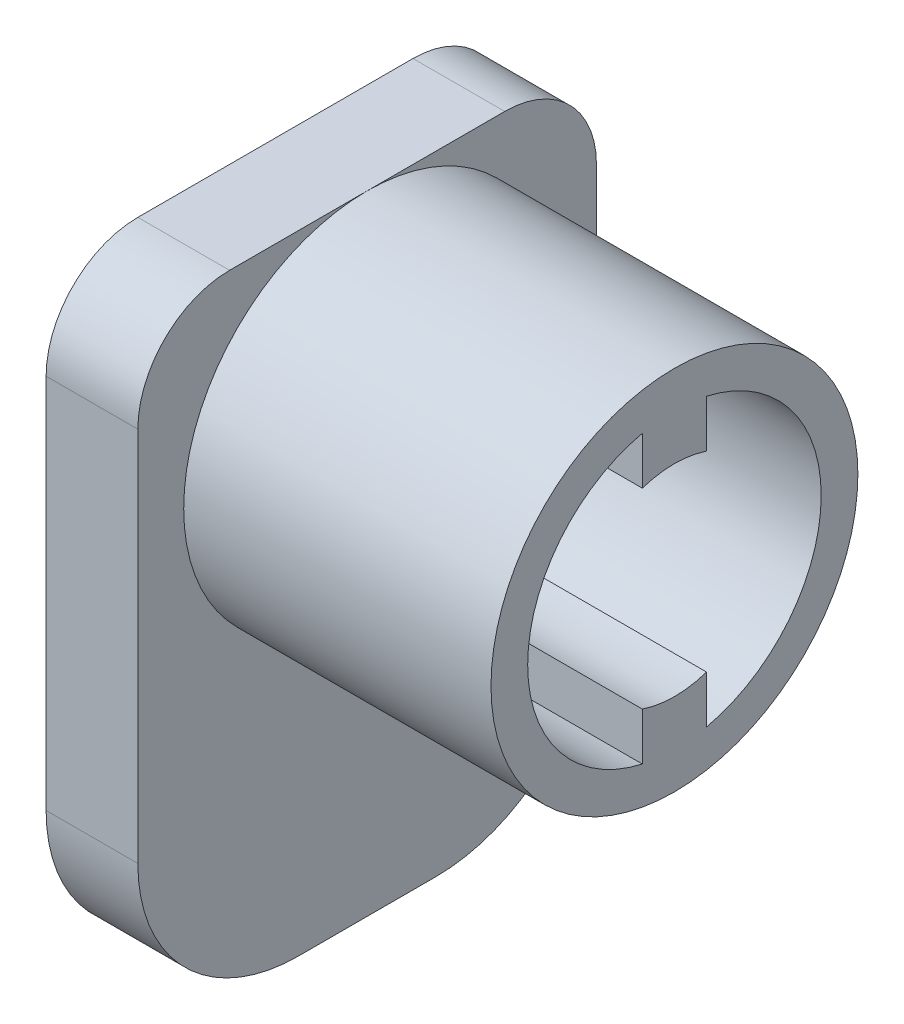
ISO-10303-21;
HEADER;
FILE_DESCRIPTION(('STEP AP214'),'2;1');
FILE_NAME('part.step','',(''),(''),'','','');
FILE_SCHEMA(('AUTOMOTIVE_DESIGN { 1 0 10303 214 1 1 1 1 }'));
ENDSEC;
DATA;
#1=APPLICATION_CONTEXT('core data for automotive mechanical design processes');
#2=APPLICATION_PROTOCOL_DEFINITION('international standard','automotive_design',2000,#1);
#3=PRODUCT_CONTEXT('',#1,'mechanical');
#4=PRODUCT('Part','Part','',(#3));
#5=PRODUCT_RELATED_PRODUCT_CATEGORY('part','',(#4));
#6=PRODUCT_DEFINITION_FORMATION('','',#4);
#7=PRODUCT_DEFINITION_CONTEXT('part definition',#1,'design');
#8=PRODUCT_DEFINITION('design','',#6,#7);
#9=PRODUCT_DEFINITION_SHAPE('','',#8);
#10=(LENGTH_UNIT() NAMED_UNIT(*) SI_UNIT(.MILLI.,.METRE.));
#11=(NAMED_UNIT(*) PLANE_ANGLE_UNIT() SI_UNIT($,.RADIAN.));
#12=(NAMED_UNIT(*) SI_UNIT($,.STERADIAN.) SOLID_ANGLE_UNIT());
#13=UNCERTAINTY_MEASURE_WITH_UNIT(LENGTH_MEASURE(1.E-05),#10,'distance_accuracy_value','');
#14=(GEOMETRIC_REPRESENTATION_CONTEXT(3) GLOBAL_UNCERTAINTY_ASSIGNED_CONTEXT((#13)) GLOBAL_UNIT_ASSIGNED_CONTEXT((#10,
#11,#12)) REPRESENTATION_CONTEXT('',''));
#15=CARTESIAN_POINT('',(0.,0.,0.));
#16=DIRECTION('',(0.,0.,1.));
#17=DIRECTION('',(1.,0.,0.));
#18=AXIS2_PLACEMENT_3D('',#15,#16,#17);
#19=CARTESIAN_POINT('',(-15.7509667991878,0.,0.));
#20=DIRECTION('',(1.,0.,0.));
#21=DIRECTION('',(0.,0.,-1.));
#22=AXIS2_PLACEMENT_3D('',#19,#20,#21);
#23=CYLINDRICAL_SURFACE('',#22,3.2);
#24=CARTESIAN_POINT('',(-6.7,0.,0.));
#25=DIRECTION('',(-1.,0.,0.));
#26=DIRECTION('',(0.,0.,1.));
#27=AXIS2_PLACEMENT_3D('',#24,#25,#26);
#28=CIRCLE('',#27,3.2);
#29=CARTESIAN_POINT('',(-6.7,3.1224989991992,0.7));
#30=VERTEX_POINT('',#29);
#31=CARTESIAN_POINT('',(-6.7,-3.1224989991992,0.7));
#32=VERTEX_POINT('',#31);
#33=EDGE_CURVE('E167',#30,#32,#28,.F.);
#34=ORIENTED_EDGE('',*,*,#33,.F.);
#35=DIRECTION('',(-1.,0.,0.));
#36=VECTOR('',#35,1.);
#37=CARTESIAN_POINT('',(1.78934113199437,3.1224989991992,0.7));
#38=LINE('',#37,#36);
#39=CARTESIAN_POINT('',(0.,3.1224989991992,0.7));
#40=VERTEX_POINT('',#39);
#41=EDGE_CURVE('E154',#40,#30,#38,.T.);
#42=ORIENTED_EDGE('',*,*,#41,.F.);
#43=CARTESIAN_POINT('',(0.,0.,0.));
#44=DIRECTION('',(1.,0.,0.));
#45=DIRECTION('',(0.,0.,-1.));
#46=AXIS2_PLACEMENT_3D('',#43,#44,#45);
#47=CIRCLE('',#46,3.2);
#48=CARTESIAN_POINT('',(0.,-3.1224989991992,0.7));
#49=VERTEX_POINT('',#48);
#50=EDGE_CURVE('E165',#40,#49,#47,.T.);
#51=ORIENTED_EDGE('',*,*,#50,.T.);
#52=DIRECTION('',(-1.,0.,0.));
#53=VECTOR('',#52,1.);
#54=CARTESIAN_POINT('',(1.78934113199437,-3.1224989991992,0.7));
#55=LINE('',#54,#53);
#56=EDGE_CURVE('E340',#49,#32,#55,.T.);
#57=ORIENTED_EDGE('',*,*,#56,.T.);
#58=EDGE_LOOP('',(#34,#42,#51,#57));
#59=FACE_BOUND('',#58,.T.);
#60=ADVANCED_FACE('F33',(#59),#23,.F.);
#61=CARTESIAN_POINT('',(-6.7,0.,0.));
#62=DIRECTION('',(1.,0.,0.));
#63=DIRECTION('',(0.,0.,-1.));
#64=AXIS2_PLACEMENT_3D('',#61,#62,#63);
#65=CYLINDRICAL_SURFACE('',#64,4.);
#66=CARTESIAN_POINT('',(-6.7,0.,0.));
#67=DIRECTION('',(1.,0.,0.));
#68=DIRECTION('',(0.,0.,-1.));
#69=AXIS2_PLACEMENT_3D('',#66,#67,#68);
#70=CIRCLE('',#69,4.);
#71=CARTESIAN_POINT('',(-6.7,4.,0.));
#72=VERTEX_POINT('',#71);
#73=EDGE_CURVE('E209',#72,#72,#70,.T.);
#74=ORIENTED_EDGE('',*,*,#73,.T.);
#75=EDGE_LOOP('',(#74));
#76=FACE_BOUND('',#75,.T.);
#77=CARTESIAN_POINT('',(0.,0.,0.));
#78=DIRECTION('',(1.,0.,0.));
#79=DIRECTION('',(0.,0.,-1.));
#80=AXIS2_PLACEMENT_3D('',#77,#78,#79);
#81=CIRCLE('',#80,4.);
#82=CARTESIAN_POINT('',(0.,0.,-4.));
#83=VERTEX_POINT('',#82);
#84=EDGE_CURVE('E200',#83,#83,#81,.T.);
#85=ORIENTED_EDGE('',*,*,#84,.F.);
#86=EDGE_LOOP('',(#85));
#87=FACE_BOUND('',#86,.T.);
#88=ADVANCED_FACE('F280',(#76,#87),#65,.T.);
#89=CARTESIAN_POINT('',(0.,0.,0.));
#90=DIRECTION('',(1.,0.,0.));
#91=DIRECTION('',(0.,0.,-1.));
#92=AXIS2_PLACEMENT_3D('',#89,#90,#91);
#93=PLANE('',#92);
#94=CARTESIAN_POINT('',(0.,-3.1224989991992,-0.7));
#95=VERTEX_POINT('',#94);
#96=CARTESIAN_POINT('',(0.,3.1224989991992,-0.700000000000001));
#97=VERTEX_POINT('',#96);
#98=EDGE_CURVE('E176',#95,#97,#47,.T.);
#99=ORIENTED_EDGE('',*,*,#98,.F.);
#100=DIRECTION('',(0.,-1.,0.));
#101=VECTOR('',#100,1.);
#102=CARTESIAN_POINT('',(0.,-2.86181760425084,-0.7));
#103=LINE('',#102,#101);
#104=CARTESIAN_POINT('',(0.,-2.08566536146142,-0.699999999999999));
#105=VERTEX_POINT('',#104);
#106=EDGE_CURVE('E314',#105,#95,#103,.T.);
#107=ORIENTED_EDGE('',*,*,#106,.F.);
#108=CARTESIAN_POINT('',(0.,0.,0.));
#109=DIRECTION('',(1.,0.,0.));
#110=DIRECTION('',(0.,0.,-1.));
#111=AXIS2_PLACEMENT_3D('',#108,#109,#110);
#112=CIRCLE('',#111,2.2);
#113=CARTESIAN_POINT('',(0.,-2.08566536146142,0.7));
#114=VERTEX_POINT('',#113);
#115=EDGE_CURVE('E335',#114,#105,#112,.T.);
#116=ORIENTED_EDGE('',*,*,#115,.F.);
#117=DIRECTION('',(0.,1.,0.));
#118=VECTOR('',#117,1.);
#119=CARTESIAN_POINT('',(0.,-2.86181760425084,0.7));
#120=LINE('',#119,#118);
#121=EDGE_CURVE('E174',#49,#114,#120,.T.);
#122=ORIENTED_EDGE('',*,*,#121,.F.);
#123=ORIENTED_EDGE('',*,*,#50,.F.);
#124=DIRECTION('',(0.,1.,0.));
#125=VECTOR('',#124,1.);
#126=CARTESIAN_POINT('',(0.,2.86181760425084,0.7));
#127=LINE('',#126,#125);
#128=CARTESIAN_POINT('',(0.,2.08566536146142,0.699999999999999));
#129=VERTEX_POINT('',#128);
#130=EDGE_CURVE('E151',#129,#40,#127,.T.);
#131=ORIENTED_EDGE('',*,*,#130,.F.);
#132=CARTESIAN_POINT('',(0.,0.,0.));
#133=DIRECTION('',(1.,0.,0.));
#134=DIRECTION('',(0.,0.,-1.));
#135=AXIS2_PLACEMENT_3D('',#132,#133,#134);
#136=CIRCLE('',#135,2.2);
#137=CARTESIAN_POINT('',(0.,2.08566536146142,-0.700000000000001));
#138=VERTEX_POINT('',#137);
#139=EDGE_CURVE('E318',#138,#129,#136,.T.);
#140=ORIENTED_EDGE('',*,*,#139,.F.);
#141=DIRECTION('',(0.,-1.,0.));
#142=VECTOR('',#141,1.);
#143=CARTESIAN_POINT('',(0.,2.08566536146142,-0.700000000000001));
#144=LINE('',#143,#142);
#145=EDGE_CURVE('E317',#97,#138,#144,.T.);
#146=ORIENTED_EDGE('',*,*,#145,.F.);
#147=EDGE_LOOP('',(#99,#107,#116,#122,#123,#131,#140,#146));
#148=FACE_BOUND('',#147,.T.);
#149=ORIENTED_EDGE('',*,*,#84,.T.);
#150=EDGE_LOOP('',(#149));
#151=FACE_BOUND('',#150,.T.);
#152=ADVANCED_FACE('F171',(#148,#151),#93,.T.);
#153=CARTESIAN_POINT('',(-8.7,4.,-5.));
#154=DIRECTION('',(0.,0.,1.));
#155=DIRECTION('',(0.,-1.,0.));
#156=AXIS2_PLACEMENT_3D('',#153,#154,#155);
#157=PLANE('',#156);
#158=DIRECTION('',(0.,-1.,0.));
#159=VECTOR('',#158,1.);
#160=CARTESIAN_POINT('',(-6.7,4.,-5.));
#161=LINE('',#160,#159);
#162=CARTESIAN_POINT('',(-6.7,2.,-5.));
#163=VERTEX_POINT('',#162);
#164=CARTESIAN_POINT('',(-6.7,-6.2,-5.));
#165=VERTEX_POINT('',#164);
#166=EDGE_CURVE('E189',#163,#165,#161,.T.);
#167=ORIENTED_EDGE('',*,*,#166,.T.);
#168=DIRECTION('',(1.,0.,0.));
#169=VECTOR('',#168,1.);
#170=CARTESIAN_POINT('',(-8.7,-6.2,-5.));
#171=LINE('',#170,#169);
#172=CARTESIAN_POINT('',(-8.7,-6.2,-5.));
#173=VERTEX_POINT('',#172);
#174=EDGE_CURVE('E56',#165,#173,#171,.F.);
#175=ORIENTED_EDGE('',*,*,#174,.T.);
#176=DIRECTION('',(0.,-1.,0.));
#177=VECTOR('',#176,1.);
#178=CARTESIAN_POINT('',(-8.7,4.,-5.));
#179=LINE('',#178,#177);
#180=CARTESIAN_POINT('',(-8.7,2.,-5.));
#181=VERTEX_POINT('',#180);
#182=EDGE_CURVE('E190',#181,#173,#179,.T.);
#183=ORIENTED_EDGE('',*,*,#182,.F.);
#184=DIRECTION('',(1.,0.,0.));
#185=VECTOR('',#184,1.);
#186=CARTESIAN_POINT('',(-8.7,2.,-5.));
#187=LINE('',#186,#185);
#188=EDGE_CURVE('E237',#181,#163,#187,.T.);
#189=ORIENTED_EDGE('',*,*,#188,.T.);
#190=EDGE_LOOP('',(#167,#175,#183,#189));
#191=FACE_BOUND('',#190,.T.);
#192=ADVANCED_FACE('F263',(#191),#157,.F.);
#193=CARTESIAN_POINT('',(-8.7,-9.7,-5.));
#194=DIRECTION('',(0.,1.,0.));
#195=DIRECTION('',(0.,0.,1.));
#196=AXIS2_PLACEMENT_3D('',#193,#194,#195);
#197=PLANE('',#196);
#198=DIRECTION('',(0.,0.,1.));
#199=VECTOR('',#198,1.);
#200=CARTESIAN_POINT('',(-8.7,-9.7,-5.));
#201=LINE('',#200,#199);
#202=CARTESIAN_POINT('',(-8.7,-9.7,-1.5));
#203=VERTEX_POINT('',#202);
#204=CARTESIAN_POINT('',(-8.7,-9.7,1.5));
#205=VERTEX_POINT('',#204);
#206=EDGE_CURVE('E192',#203,#205,#201,.T.);
#207=ORIENTED_EDGE('',*,*,#206,.F.);
#208=DIRECTION('',(1.,0.,0.));
#209=VECTOR('',#208,1.);
#210=CARTESIAN_POINT('',(-8.7,-9.7,-1.5));
#211=LINE('',#210,#209);
#212=CARTESIAN_POINT('',(-6.7,-9.7,-1.5));
#213=VERTEX_POINT('',#212);
#214=EDGE_CURVE('E242',#203,#213,#211,.T.);
#215=ORIENTED_EDGE('',*,*,#214,.T.);
#216=DIRECTION('',(0.,0.,1.));
#217=VECTOR('',#216,1.);
#218=CARTESIAN_POINT('',(-6.7,-9.7,-5.));
#219=LINE('',#218,#217);
#220=CARTESIAN_POINT('',(-6.7,-9.7,1.5));
#221=VERTEX_POINT('',#220);
#222=EDGE_CURVE('E202',#213,#221,#219,.T.);
#223=ORIENTED_EDGE('',*,*,#222,.T.);
#224=DIRECTION('',(1.,0.,0.));
#225=VECTOR('',#224,1.);
#226=CARTESIAN_POINT('',(-8.7,-9.7,1.5));
#227=LINE('',#226,#225);
#228=EDGE_CURVE('E240',#221,#205,#227,.F.);
#229=ORIENTED_EDGE('',*,*,#228,.T.);
#230=EDGE_LOOP('',(#207,#215,#223,#229));
#231=FACE_BOUND('',#230,.T.);
#232=ADVANCED_FACE('F256',(#231),#197,.F.);
#233=CARTESIAN_POINT('',(-8.7,4.,5.));
#234=DIRECTION('',(0.,0.,-1.));
#235=DIRECTION('',(0.,1.,0.));
#236=AXIS2_PLACEMENT_3D('',#233,#234,#235);
#237=PLANE('',#236);
#238=DIRECTION('',(0.,1.,0.));
#239=VECTOR('',#238,1.);
#240=CARTESIAN_POINT('',(-8.7,4.,5.));
#241=LINE('',#240,#239);
#242=CARTESIAN_POINT('',(-8.7,-6.2,5.));
#243=VERTEX_POINT('',#242);
#244=CARTESIAN_POINT('',(-8.7,2.,5.));
#245=VERTEX_POINT('',#244);
#246=EDGE_CURVE('E195',#243,#245,#241,.T.);
#247=ORIENTED_EDGE('',*,*,#246,.F.);
#248=DIRECTION('',(1.,0.,0.));
#249=VECTOR('',#248,1.);
#250=CARTESIAN_POINT('',(-8.7,-6.2,5.));
#251=LINE('',#250,#249);
#252=CARTESIAN_POINT('',(-6.7,-6.2,5.));
#253=VERTEX_POINT('',#252);
#254=EDGE_CURVE('E11',#243,#253,#251,.T.);
#255=ORIENTED_EDGE('',*,*,#254,.T.);
#256=DIRECTION('',(0.,1.,0.));
#257=VECTOR('',#256,1.);
#258=CARTESIAN_POINT('',(-6.7,4.,5.));
#259=LINE('',#258,#257);
#260=CARTESIAN_POINT('',(-6.7,2.,5.));
#261=VERTEX_POINT('',#260);
#262=EDGE_CURVE('E205',#253,#261,#259,.T.);
#263=ORIENTED_EDGE('',*,*,#262,.T.);
#264=DIRECTION('',(1.,0.,0.));
#265=VECTOR('',#264,1.);
#266=CARTESIAN_POINT('',(-8.7,2.,5.));
#267=LINE('',#266,#265);
#268=EDGE_CURVE('E230',#261,#245,#267,.F.);
#269=ORIENTED_EDGE('',*,*,#268,.T.);
#270=EDGE_LOOP('',(#247,#255,#263,#269));
#271=FACE_BOUND('',#270,.T.);
#272=ADVANCED_FACE('F363',(#271),#237,.F.);
#273=CARTESIAN_POINT('',(-8.7,4.,-5.));
#274=DIRECTION('',(0.,-1.,0.));
#275=DIRECTION('',(0.,0.,-1.));
#276=AXIS2_PLACEMENT_3D('',#273,#274,#275);
#277=PLANE('',#276);
#278=DIRECTION('',(0.,0.,-1.));
#279=VECTOR('',#278,1.);
#280=CARTESIAN_POINT('',(-8.7,4.,-5.));
#281=LINE('',#280,#279);
#282=CARTESIAN_POINT('',(-8.7,4.,3.));
#283=VERTEX_POINT('',#282);
#284=CARTESIAN_POINT('',(-8.7,4.,-3.));
#285=VERTEX_POINT('',#284);
#286=EDGE_CURVE('E197',#283,#285,#281,.T.);
#287=ORIENTED_EDGE('',*,*,#286,.F.);
#288=DIRECTION('',(1.,0.,0.));
#289=VECTOR('',#288,1.);
#290=CARTESIAN_POINT('',(-8.7,4.,3.));
#291=LINE('',#290,#289);
#292=CARTESIAN_POINT('',(-6.7,4.,3.));
#293=VERTEX_POINT('',#292);
#294=EDGE_CURVE('E222',#283,#293,#291,.T.);
#295=ORIENTED_EDGE('',*,*,#294,.T.);
#296=DIRECTION('',(0.,0.,-1.));
#297=VECTOR('',#296,1.);
#298=CARTESIAN_POINT('',(-6.7,4.,-5.));
#299=LINE('',#298,#297);
#300=EDGE_CURVE('E193',#293,#72,#299,.T.);
#301=ORIENTED_EDGE('',*,*,#300,.T.);
#302=CARTESIAN_POINT('',(-6.7,4.,-3.));
#303=VERTEX_POINT('',#302);
#304=EDGE_CURVE('E207',#72,#303,#299,.T.);
#305=ORIENTED_EDGE('',*,*,#304,.T.);
#306=DIRECTION('',(1.,0.,0.));
#307=VECTOR('',#306,1.);
#308=CARTESIAN_POINT('',(-8.7,4.,-3.));
#309=LINE('',#308,#307);
#310=EDGE_CURVE('E220',#303,#285,#309,.F.);
#311=ORIENTED_EDGE('',*,*,#310,.T.);
#312=EDGE_LOOP('',(#287,#295,#301,#305,#311));
#313=FACE_BOUND('',#312,.T.);
#314=ADVANCED_FACE('F274',(#313),#277,.F.);
#315=CARTESIAN_POINT('',(-8.7,-9.7,-5.));
#316=DIRECTION('',(-1.,0.,0.));
#317=DIRECTION('',(0.,0.,1.));
#318=AXIS2_PLACEMENT_3D('',#315,#316,#317);
#319=PLANE('',#318);
#320=CARTESIAN_POINT('',(-8.7,0.,0.));
#321=DIRECTION('',(-1.,0.,0.));
#322=DIRECTION('',(0.,0.,1.));
#323=AXIS2_PLACEMENT_3D('',#320,#321,#322);
#324=CIRCLE('',#323,1.6);
#325=CARTESIAN_POINT('',(-8.7,0.,1.6));
#326=VERTEX_POINT('',#325);
#327=EDGE_CURVE('E181',#326,#326,#324,.T.);
#328=ORIENTED_EDGE('',*,*,#327,.F.);
#329=EDGE_LOOP('',(#328));
#330=FACE_BOUND('',#329,.T.);
#331=ORIENTED_EDGE('',*,*,#182,.T.);
#332=CARTESIAN_POINT('',(-8.7,-6.2,-1.5));
#333=DIRECTION('',(-1.,0.,0.));
#334=DIRECTION('',(0.,0.,1.));
#335=AXIS2_PLACEMENT_3D('',#332,#333,#334);
#336=CIRCLE('',#335,3.5);
#337=EDGE_CURVE('E41',#173,#203,#336,.T.);
#338=ORIENTED_EDGE('',*,*,#337,.T.);
#339=ORIENTED_EDGE('',*,*,#206,.T.);
#340=CARTESIAN_POINT('',(-8.7,-6.2,1.5));
#341=DIRECTION('',(-1.,0.,0.));
#342=DIRECTION('',(0.,0.,1.));
#343=AXIS2_PLACEMENT_3D('',#340,#341,#342);
#344=CIRCLE('',#343,3.5);
#345=EDGE_CURVE('E48',#205,#243,#344,.T.);
#346=ORIENTED_EDGE('',*,*,#345,.T.);
#347=ORIENTED_EDGE('',*,*,#246,.T.);
#348=CARTESIAN_POINT('',(-8.7,2.,3.));
#349=DIRECTION('',(-1.,0.,0.));
#350=DIRECTION('',(0.,0.,1.));
#351=AXIS2_PLACEMENT_3D('',#348,#349,#350);
#352=CIRCLE('',#351,2.);
#353=EDGE_CURVE('E235',#245,#283,#352,.T.);
#354=ORIENTED_EDGE('',*,*,#353,.T.);
#355=ORIENTED_EDGE('',*,*,#286,.T.);
#356=CARTESIAN_POINT('',(-8.7,2.,-3.));
#357=DIRECTION('',(-1.,0.,0.));
#358=DIRECTION('',(0.,0.,1.));
#359=AXIS2_PLACEMENT_3D('',#356,#357,#358);
#360=CIRCLE('',#359,2.);
#361=EDGE_CURVE('E233',#285,#181,#360,.T.);
#362=ORIENTED_EDGE('',*,*,#361,.T.);
#363=EDGE_LOOP('',(#331,#338,#339,#346,#347,#354,#355,#362));
#364=FACE_BOUND('',#363,.T.);
#365=ADVANCED_FACE('F252',(#330,#364),#319,.T.);
#366=CARTESIAN_POINT('',(-6.7,-9.7,-5.));
#367=DIRECTION('',(-1.,0.,0.));
#368=DIRECTION('',(0.,0.,1.));
#369=AXIS2_PLACEMENT_3D('',#366,#367,#368);
#370=PLANE('',#369);
#371=ORIENTED_EDGE('',*,*,#222,.F.);
#372=CARTESIAN_POINT('',(-6.7,-6.2,-1.5));
#373=DIRECTION('',(-1.,0.,0.));
#374=DIRECTION('',(0.,0.,1.));
#375=AXIS2_PLACEMENT_3D('',#372,#373,#374);
#376=CIRCLE('',#375,3.5);
#377=EDGE_CURVE('E247',#213,#165,#376,.F.);
#378=ORIENTED_EDGE('',*,*,#377,.T.);
#379=ORIENTED_EDGE('',*,*,#166,.F.);
#380=CARTESIAN_POINT('',(-6.7,2.,-3.));
#381=DIRECTION('',(-1.,0.,0.));
#382=DIRECTION('',(0.,0.,1.));
#383=AXIS2_PLACEMENT_3D('',#380,#381,#382);
#384=CIRCLE('',#383,2.);
#385=EDGE_CURVE('E225',#163,#303,#384,.F.);
#386=ORIENTED_EDGE('',*,*,#385,.T.);
#387=ORIENTED_EDGE('',*,*,#304,.F.);
#388=ORIENTED_EDGE('',*,*,#73,.F.);
#389=ORIENTED_EDGE('',*,*,#300,.F.);
#390=CARTESIAN_POINT('',(-6.7,2.,3.));
#391=DIRECTION('',(-1.,0.,0.));
#392=DIRECTION('',(0.,0.,1.));
#393=AXIS2_PLACEMENT_3D('',#390,#391,#392);
#394=CIRCLE('',#393,2.);
#395=EDGE_CURVE('E227',#293,#261,#394,.F.);
#396=ORIENTED_EDGE('',*,*,#395,.T.);
#397=ORIENTED_EDGE('',*,*,#262,.F.);
#398=CARTESIAN_POINT('',(-6.7,-6.2,1.5));
#399=DIRECTION('',(-1.,0.,0.));
#400=DIRECTION('',(0.,0.,1.));
#401=AXIS2_PLACEMENT_3D('',#398,#399,#400);
#402=CIRCLE('',#401,3.5);
#403=EDGE_CURVE('E245',#253,#221,#402,.F.);
#404=ORIENTED_EDGE('',*,*,#403,.T.);
#405=EDGE_LOOP('',(#371,#378,#379,#386,#387,#388,#389,#396,#397,#404));
#406=FACE_BOUND('',#405,.T.);
#407=ADVANCED_FACE('F262',(#406),#370,.F.);
#408=CARTESIAN_POINT('',(-6.7,-9.7,-5.));
#409=DIRECTION('',(-1.,0.,0.));
#410=DIRECTION('',(0.,0.,1.));
#411=AXIS2_PLACEMENT_3D('',#408,#409,#410);
#412=PLANE('',#411);
#413=CARTESIAN_POINT('',(-6.7,0.,0.));
#414=DIRECTION('',(-1.,0.,0.));
#415=DIRECTION('',(0.,0.,1.));
#416=AXIS2_PLACEMENT_3D('',#413,#414,#415);
#417=CIRCLE('',#416,1.6);
#418=CARTESIAN_POINT('',(-6.7,0.,1.6));
#419=VERTEX_POINT('',#418);
#420=EDGE_CURVE('E177',#419,#419,#417,.T.);
#421=ORIENTED_EDGE('',*,*,#420,.T.);
#422=EDGE_LOOP('',(#421));
#423=FACE_BOUND('',#422,.T.);
#424=CARTESIAN_POINT('',(-6.7,0.,0.));
#425=DIRECTION('',(-1.,0.,0.));
#426=DIRECTION('',(0.,0.,1.));
#427=AXIS2_PLACEMENT_3D('',#424,#425,#426);
#428=CIRCLE('',#427,2.2);
#429=CARTESIAN_POINT('',(-6.7,2.08566536146142,-0.700000000000001));
#430=VERTEX_POINT('',#429);
#431=CARTESIAN_POINT('',(-6.7,2.08566536146142,0.7));
#432=VERTEX_POINT('',#431);
#433=EDGE_CURVE('E217',#430,#432,#428,.F.);
#434=ORIENTED_EDGE('',*,*,#433,.T.);
#435=DIRECTION('',(0.,1.,0.));
#436=VECTOR('',#435,1.);
#437=CARTESIAN_POINT('',(-6.7,-9.7,0.699999999999989));
#438=LINE('',#437,#436);
#439=EDGE_CURVE('E332',#432,#30,#438,.T.);
#440=ORIENTED_EDGE('',*,*,#439,.T.);
#441=ORIENTED_EDGE('',*,*,#33,.T.);
#442=DIRECTION('',(0.,1.,0.));
#443=VECTOR('',#442,1.);
#444=CARTESIAN_POINT('',(-6.7,-9.7,0.699999999999998));
#445=LINE('',#444,#443);
#446=CARTESIAN_POINT('',(-6.7,-2.08566536146142,0.7));
#447=VERTEX_POINT('',#446);
#448=EDGE_CURVE('E347',#32,#447,#445,.T.);
#449=ORIENTED_EDGE('',*,*,#448,.T.);
#450=CARTESIAN_POINT('',(-6.7,0.,0.));
#451=DIRECTION('',(-1.,0.,0.));
#452=DIRECTION('',(0.,0.,1.));
#453=AXIS2_PLACEMENT_3D('',#450,#451,#452);
#454=CIRCLE('',#453,2.2);
#455=CARTESIAN_POINT('',(-6.7,-2.08566536146142,-0.700000000000001));
#456=VERTEX_POINT('',#455);
#457=EDGE_CURVE('E212',#447,#456,#454,.F.);
#458=ORIENTED_EDGE('',*,*,#457,.T.);
#459=DIRECTION('',(0.,-1.,0.));
#460=VECTOR('',#459,1.);
#461=CARTESIAN_POINT('',(-6.7,-9.7,-0.700000000000009));
#462=LINE('',#461,#460);
#463=CARTESIAN_POINT('',(-6.7,-3.1224989991992,-0.7));
#464=VERTEX_POINT('',#463);
#465=EDGE_CURVE('E349',#456,#464,#462,.T.);
#466=ORIENTED_EDGE('',*,*,#465,.T.);
#467=CARTESIAN_POINT('',(-6.7,3.1224989991992,-0.7));
#468=VERTEX_POINT('',#467);
#469=EDGE_CURVE('E186',#464,#468,#28,.F.);
#470=ORIENTED_EDGE('',*,*,#469,.T.);
#471=DIRECTION('',(0.,-1.,0.));
#472=VECTOR('',#471,1.);
#473=CARTESIAN_POINT('',(-6.7,-9.7,-0.700000000000006));
#474=LINE('',#473,#472);
#475=EDGE_CURVE('E326',#468,#430,#474,.T.);
#476=ORIENTED_EDGE('',*,*,#475,.T.);
#477=EDGE_LOOP('',(#434,#440,#441,#449,#458,#466,#470,#476));
#478=FACE_BOUND('',#477,.T.);
#479=ADVANCED_FACE('F300',(#423,#478),#412,.F.);
#480=ORIENTED_EDGE('',*,*,#98,.T.);
#481=DIRECTION('',(-1.,0.,0.));
#482=VECTOR('',#481,1.);
#483=CARTESIAN_POINT('',(1.78934113199437,3.1224989991992,-0.700000000000001));
#484=LINE('',#483,#482);
#485=EDGE_CURVE('E168',#97,#468,#484,.T.);
#486=ORIENTED_EDGE('',*,*,#485,.T.);
#487=ORIENTED_EDGE('',*,*,#469,.F.);
#488=DIRECTION('',(-1.,0.,0.));
#489=VECTOR('',#488,1.);
#490=CARTESIAN_POINT('',(1.78934113199437,-3.1224989991992,-0.7));
#491=LINE('',#490,#489);
#492=EDGE_CURVE('E313',#95,#464,#491,.T.);
#493=ORIENTED_EDGE('',*,*,#492,.F.);
#494=EDGE_LOOP('',(#480,#486,#487,#493));
#495=FACE_BOUND('',#494,.T.);
#496=ADVANCED_FACE('F293',(#495),#23,.F.);
#497=CARTESIAN_POINT('',(0.,0.,0.));
#498=DIRECTION('',(-1.,0.,0.));
#499=DIRECTION('',(0.,0.,1.));
#500=AXIS2_PLACEMENT_3D('',#497,#498,#499);
#501=CYLINDRICAL_SURFACE('',#500,1.6);
#502=ORIENTED_EDGE('',*,*,#327,.T.);
#503=EDGE_LOOP('',(#502));
#504=FACE_BOUND('',#503,.T.);
#505=ORIENTED_EDGE('',*,*,#420,.F.);
#506=EDGE_LOOP('',(#505));
#507=FACE_BOUND('',#506,.T.);
#508=ADVANCED_FACE('F299',(#504,#507),#501,.F.);
#509=CARTESIAN_POINT('',(1.78934113199437,0.,0.));
#510=DIRECTION('',(-1.,0.,0.));
#511=DIRECTION('',(0.,0.,1.));
#512=AXIS2_PLACEMENT_3D('',#509,#510,#511);
#513=CYLINDRICAL_SURFACE('',#512,2.2);
#514=ORIENTED_EDGE('',*,*,#457,.F.);
#515=DIRECTION('',(-1.,0.,0.));
#516=VECTOR('',#515,1.);
#517=CARTESIAN_POINT('',(1.78934113199437,-2.08566536146142,0.7));
#518=LINE('',#517,#516);
#519=EDGE_CURVE('E338',#114,#447,#518,.T.);
#520=ORIENTED_EDGE('',*,*,#519,.F.);
#521=ORIENTED_EDGE('',*,*,#115,.T.);
#522=DIRECTION('',(-1.,0.,0.));
#523=VECTOR('',#522,1.);
#524=CARTESIAN_POINT('',(1.78934113199437,-2.08566536146142,-0.700000000000001));
#525=LINE('',#524,#523);
#526=EDGE_CURVE('E337',#105,#456,#525,.T.);
#527=ORIENTED_EDGE('',*,*,#526,.T.);
#528=EDGE_LOOP('',(#514,#520,#521,#527));
#529=FACE_BOUND('',#528,.T.);
#530=ADVANCED_FACE('F306',(#529),#513,.F.);
#531=CARTESIAN_POINT('',(1.78934113199437,-2.86181760425084,-0.7));
#532=DIRECTION('',(0.,0.,-1.));
#533=DIRECTION('',(0.,1.,0.));
#534=AXIS2_PLACEMENT_3D('',#531,#532,#533);
#535=PLANE('',#534);
#536=ORIENTED_EDGE('',*,*,#465,.F.);
#537=ORIENTED_EDGE('',*,*,#526,.F.);
#538=ORIENTED_EDGE('',*,*,#106,.T.);
#539=ORIENTED_EDGE('',*,*,#492,.T.);
#540=EDGE_LOOP('',(#536,#537,#538,#539));
#541=FACE_BOUND('',#540,.T.);
#542=ADVANCED_FACE('F462',(#541),#535,.T.);
#543=CARTESIAN_POINT('',(1.78934113199437,-2.86181760425084,0.7));
#544=DIRECTION('',(0.,0.,1.));
#545=DIRECTION('',(0.,-1.,0.));
#546=AXIS2_PLACEMENT_3D('',#543,#544,#545);
#547=PLANE('',#546);
#548=ORIENTED_EDGE('',*,*,#448,.F.);
#549=ORIENTED_EDGE('',*,*,#56,.F.);
#550=ORIENTED_EDGE('',*,*,#121,.T.);
#551=ORIENTED_EDGE('',*,*,#519,.T.);
#552=EDGE_LOOP('',(#548,#549,#550,#551));
#553=FACE_BOUND('',#552,.T.);
#554=ADVANCED_FACE('F473',(#553),#547,.T.);
#555=CARTESIAN_POINT('',(1.78934113199437,0.,0.));
#556=DIRECTION('',(-1.,0.,0.));
#557=DIRECTION('',(0.,0.,1.));
#558=AXIS2_PLACEMENT_3D('',#555,#556,#557);
#559=CYLINDRICAL_SURFACE('',#558,2.2);
#560=ORIENTED_EDGE('',*,*,#433,.F.);
#561=DIRECTION('',(-1.,0.,0.));
#562=VECTOR('',#561,1.);
#563=CARTESIAN_POINT('',(1.78934113199437,2.08566536146142,-0.700000000000001));
#564=LINE('',#563,#562);
#565=EDGE_CURVE('E322',#138,#430,#564,.T.);
#566=ORIENTED_EDGE('',*,*,#565,.F.);
#567=ORIENTED_EDGE('',*,*,#139,.T.);
#568=DIRECTION('',(-1.,0.,0.));
#569=VECTOR('',#568,1.);
#570=CARTESIAN_POINT('',(1.78934113199437,2.08566536146142,0.7));
#571=LINE('',#570,#569);
#572=EDGE_CURVE('E157',#129,#432,#571,.T.);
#573=ORIENTED_EDGE('',*,*,#572,.T.);
#574=EDGE_LOOP('',(#560,#566,#567,#573));
#575=FACE_BOUND('',#574,.T.);
#576=ADVANCED_FACE('F484',(#575),#559,.F.);
#577=CARTESIAN_POINT('',(1.78934113199437,2.86181760425084,0.7));
#578=DIRECTION('',(0.,0.,1.));
#579=DIRECTION('',(0.,-1.,0.));
#580=AXIS2_PLACEMENT_3D('',#577,#578,#579);
#581=PLANE('',#580);
#582=ORIENTED_EDGE('',*,*,#439,.F.);
#583=ORIENTED_EDGE('',*,*,#572,.F.);
#584=ORIENTED_EDGE('',*,*,#130,.T.);
#585=ORIENTED_EDGE('',*,*,#41,.T.);
#586=EDGE_LOOP('',(#582,#583,#584,#585));
#587=FACE_BOUND('',#586,.T.);
#588=ADVANCED_FACE('F153',(#587),#581,.T.);
#589=CARTESIAN_POINT('',(1.78934113199437,2.08566536146142,-0.700000000000001));
#590=DIRECTION('',(0.,0.,-1.));
#591=DIRECTION('',(0.,1.,0.));
#592=AXIS2_PLACEMENT_3D('',#589,#590,#591);
#593=PLANE('',#592);
#594=ORIENTED_EDGE('',*,*,#475,.F.);
#595=ORIENTED_EDGE('',*,*,#485,.F.);
#596=ORIENTED_EDGE('',*,*,#145,.T.);
#597=ORIENTED_EDGE('',*,*,#565,.T.);
#598=EDGE_LOOP('',(#594,#595,#596,#597));
#599=FACE_BOUND('',#598,.T.);
#600=ADVANCED_FACE('F324',(#599),#593,.T.);
#601=CARTESIAN_POINT('',(-8.7,2.,3.));
#602=DIRECTION('',(1.,0.,0.));
#603=DIRECTION('',(0.,0.,-1.));
#604=AXIS2_PLACEMENT_3D('',#601,#602,#603);
#605=CYLINDRICAL_SURFACE('',#604,2.);
#606=ORIENTED_EDGE('',*,*,#353,.F.);
#607=ORIENTED_EDGE('',*,*,#268,.F.);
#608=ORIENTED_EDGE('',*,*,#395,.F.);
#609=ORIENTED_EDGE('',*,*,#294,.F.);
#610=EDGE_LOOP('',(#606,#607,#608,#609));
#611=FACE_BOUND('',#610,.T.);
#612=ADVANCED_FACE('F393',(#611),#605,.T.);
#613=CARTESIAN_POINT('',(-8.7,2.,-3.));
#614=DIRECTION('',(1.,0.,0.));
#615=DIRECTION('',(0.,0.,-1.));
#616=AXIS2_PLACEMENT_3D('',#613,#614,#615);
#617=CYLINDRICAL_SURFACE('',#616,2.);
#618=ORIENTED_EDGE('',*,*,#361,.F.);
#619=ORIENTED_EDGE('',*,*,#310,.F.);
#620=ORIENTED_EDGE('',*,*,#385,.F.);
#621=ORIENTED_EDGE('',*,*,#188,.F.);
#622=EDGE_LOOP('',(#618,#619,#620,#621));
#623=FACE_BOUND('',#622,.T.);
#624=ADVANCED_FACE('F267',(#623),#617,.T.);
#625=CARTESIAN_POINT('',(-8.7,-6.2,-1.5));
#626=DIRECTION('',(1.,0.,0.));
#627=DIRECTION('',(0.,0.,-1.));
#628=AXIS2_PLACEMENT_3D('',#625,#626,#627);
#629=CYLINDRICAL_SURFACE('',#628,3.5);
#630=ORIENTED_EDGE('',*,*,#337,.F.);
#631=ORIENTED_EDGE('',*,*,#174,.F.);
#632=ORIENTED_EDGE('',*,*,#377,.F.);
#633=ORIENTED_EDGE('',*,*,#214,.F.);
#634=EDGE_LOOP('',(#630,#631,#632,#633));
#635=FACE_BOUND('',#634,.T.);
#636=ADVANCED_FACE('F259',(#635),#629,.T.);
#637=CARTESIAN_POINT('',(-8.7,-6.2,1.5));
#638=DIRECTION('',(1.,0.,0.));
#639=DIRECTION('',(0.,0.,-1.));
#640=AXIS2_PLACEMENT_3D('',#637,#638,#639);
#641=CYLINDRICAL_SURFACE('',#640,3.5);
#642=ORIENTED_EDGE('',*,*,#345,.F.);
#643=ORIENTED_EDGE('',*,*,#228,.F.);
#644=ORIENTED_EDGE('',*,*,#403,.F.);
#645=ORIENTED_EDGE('',*,*,#254,.F.);
#646=EDGE_LOOP('',(#642,#643,#644,#645));
#647=FACE_BOUND('',#646,.T.);
#648=ADVANCED_FACE('F35',(#647),#641,.T.);
#649=CLOSED_SHELL('',(#60,#88,#152,#192,#232,#272,#314,#365,#407,#479,#496,#508,#530,#542,#554,
#576,#588,#600,#612,#624,#636,#648));
#650=MANIFOLD_SOLID_BREP('B2',#649);
#651=ADVANCED_BREP_SHAPE_REPRESENTATION('',(#18,#650),#14);
#652=SHAPE_DEFINITION_REPRESENTATION(#9,#651);
ENDSEC;
END-ISO-10303-21;
